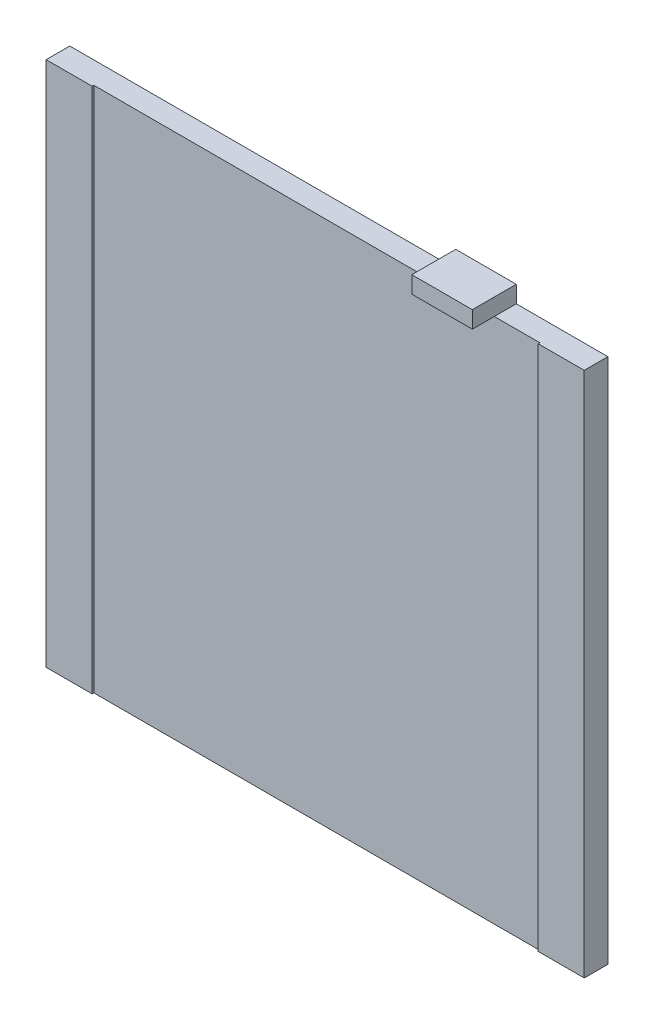
ISO-10303-21;
HEADER;
FILE_DESCRIPTION(('STEP AP214'),'2;1');
FILE_NAME('part.step','',(''),(''),'','','');
FILE_SCHEMA(('AUTOMOTIVE_DESIGN { 1 0 10303 214 1 1 1 1 }'));
ENDSEC;
DATA;
#1=APPLICATION_CONTEXT('core data for automotive mechanical design processes');
#2=APPLICATION_PROTOCOL_DEFINITION('international standard','automotive_design',2000,#1);
#3=PRODUCT_CONTEXT('',#1,'mechanical');
#4=PRODUCT('Part','Part','',(#3));
#5=PRODUCT_RELATED_PRODUCT_CATEGORY('part','',(#4));
#6=PRODUCT_DEFINITION_FORMATION('','',#4);
#7=PRODUCT_DEFINITION_CONTEXT('part definition',#1,'design');
#8=PRODUCT_DEFINITION('design','',#6,#7);
#9=PRODUCT_DEFINITION_SHAPE('','',#8);
#10=(LENGTH_UNIT() NAMED_UNIT(*) SI_UNIT(.MILLI.,.METRE.));
#11=(NAMED_UNIT(*) PLANE_ANGLE_UNIT() SI_UNIT($,.RADIAN.));
#12=(NAMED_UNIT(*) SI_UNIT($,.STERADIAN.) SOLID_ANGLE_UNIT());
#13=UNCERTAINTY_MEASURE_WITH_UNIT(LENGTH_MEASURE(1.E-05),#10,'distance_accuracy_value','');
#14=(GEOMETRIC_REPRESENTATION_CONTEXT(3) GLOBAL_UNCERTAINTY_ASSIGNED_CONTEXT((#13)) GLOBAL_UNIT_ASSIGNED_CONTEXT((#10,
#11,#12)) REPRESENTATION_CONTEXT('',''));
#15=CARTESIAN_POINT('',(0.,0.,0.));
#16=DIRECTION('',(0.,0.,1.));
#17=DIRECTION('',(1.,0.,0.));
#18=AXIS2_PLACEMENT_3D('',#15,#16,#17);
#19=CARTESIAN_POINT('',(0.,155.74,6.5));
#20=DIRECTION('',(0.,-1.,0.));
#21=DIRECTION('',(0.,0.,-1.));
#22=AXIS2_PLACEMENT_3D('',#19,#20,#21);
#23=PLANE('',#22);
#24=DIRECTION('',(0.,0.,-1.));
#25=VECTOR('',#24,1.);
#26=CARTESIAN_POINT('',(132.14,155.74,0.));
#27=LINE('',#26,#25);
#28=CARTESIAN_POINT('',(132.14,155.74,6.5));
#29=VERTEX_POINT('',#28);
#30=CARTESIAN_POINT('',(132.14,155.74,0.));
#31=VERTEX_POINT('',#30);
#32=EDGE_CURVE('E11',#29,#31,#27,.T.);
#33=ORIENTED_EDGE('',*,*,#32,.F.);
#34=DIRECTION('',(-1.,0.,0.));
#35=VECTOR('',#34,1.);
#36=CARTESIAN_POINT('',(0.,155.74,6.5));
#37=LINE('',#36,#35);
#38=CARTESIAN_POINT('',(145.64,155.74,6.5));
#39=VERTEX_POINT('',#38);
#40=EDGE_CURVE('E203',#39,#29,#37,.T.);
#41=ORIENTED_EDGE('',*,*,#40,.F.);
#42=DIRECTION('',(0.,0.,-1.));
#43=VECTOR('',#42,1.);
#44=CARTESIAN_POINT('',(145.64,155.74,7.));
#45=LINE('',#44,#43);
#46=CARTESIAN_POINT('',(145.64,155.74,7.));
#47=VERTEX_POINT('',#46);
#48=EDGE_CURVE('E195',#47,#39,#45,.T.);
#49=ORIENTED_EDGE('',*,*,#48,.F.);
#50=DIRECTION('',(-1.,0.,0.));
#51=VECTOR('',#50,1.);
#52=CARTESIAN_POINT('',(159.25,155.74,7.));
#53=LINE('',#52,#51);
#54=CARTESIAN_POINT('',(159.25,155.74,7.));
#55=VERTEX_POINT('',#54);
#56=EDGE_CURVE('E179',#55,#47,#53,.T.);
#57=ORIENTED_EDGE('',*,*,#56,.F.);
#58=DIRECTION('',(0.,0.,-1.));
#59=VECTOR('',#58,1.);
#60=CARTESIAN_POINT('',(159.25,155.74,6.5));
#61=LINE('',#60,#59);
#62=CARTESIAN_POINT('',(159.25,155.74,0.));
#63=VERTEX_POINT('',#62);
#64=EDGE_CURVE('E217',#55,#63,#61,.T.);
#65=ORIENTED_EDGE('',*,*,#64,.T.);
#66=DIRECTION('',(-1.,0.,0.));
#67=VECTOR('',#66,1.);
#68=CARTESIAN_POINT('',(0.,155.74,0.));
#69=LINE('',#68,#67);
#70=EDGE_CURVE('E202',#63,#31,#69,.T.);
#71=ORIENTED_EDGE('',*,*,#70,.T.);
#72=EDGE_LOOP('',(#33,#41,#49,#57,#65,#71));
#73=FACE_BOUND('',#72,.T.);
#74=ADVANCED_FACE('F32',(#73),#23,.F.);
#75=DIRECTION('',(0.,0.,1.));
#76=VECTOR('',#75,1.);
#77=CARTESIAN_POINT('',(114.22,155.74,0.));
#78=LINE('',#77,#76);
#79=CARTESIAN_POINT('',(114.22,155.74,0.));
#80=VERTEX_POINT('',#79);
#81=CARTESIAN_POINT('',(114.22,155.74,6.5));
#82=VERTEX_POINT('',#81);
#83=EDGE_CURVE('E55',#80,#82,#78,.T.);
#84=ORIENTED_EDGE('',*,*,#83,.F.);
#85=CARTESIAN_POINT('',(0.,155.74,0.));
#86=VERTEX_POINT('',#85);
#87=EDGE_CURVE('E213',#80,#86,#69,.T.);
#88=ORIENTED_EDGE('',*,*,#87,.T.);
#89=DIRECTION('',(0.,0.,-1.));
#90=VECTOR('',#89,1.);
#91=CARTESIAN_POINT('',(0.,155.74,6.5));
#92=LINE('',#91,#90);
#93=CARTESIAN_POINT('',(0.,155.74,7.));
#94=VERTEX_POINT('',#93);
#95=EDGE_CURVE('E205',#94,#86,#92,.T.);
#96=ORIENTED_EDGE('',*,*,#95,.F.);
#97=DIRECTION('',(1.,0.,0.));
#98=VECTOR('',#97,1.);
#99=CARTESIAN_POINT('',(0.,155.74,7.));
#100=LINE('',#99,#98);
#101=CARTESIAN_POINT('',(13.61,155.74,7.));
#102=VERTEX_POINT('',#101);
#103=EDGE_CURVE('E169',#94,#102,#100,.T.);
#104=ORIENTED_EDGE('',*,*,#103,.T.);
#105=DIRECTION('',(0.,0.,-1.));
#106=VECTOR('',#105,1.);
#107=CARTESIAN_POINT('',(13.61,155.74,7.));
#108=LINE('',#107,#106);
#109=CARTESIAN_POINT('',(13.61,155.74,6.5));
#110=VERTEX_POINT('',#109);
#111=EDGE_CURVE('E157',#102,#110,#108,.T.);
#112=ORIENTED_EDGE('',*,*,#111,.T.);
#113=EDGE_CURVE('E201',#82,#110,#37,.T.);
#114=ORIENTED_EDGE('',*,*,#113,.F.);
#115=EDGE_LOOP('',(#84,#88,#96,#104,#112,#114));
#116=FACE_BOUND('',#115,.T.);
#117=ADVANCED_FACE('F251',(#116),#23,.F.);
#118=CARTESIAN_POINT('',(0.,0.,6.5));
#119=DIRECTION('',(0.,0.,-1.));
#120=DIRECTION('',(-1.,0.,0.));
#121=AXIS2_PLACEMENT_3D('',#118,#119,#120);
#122=PLANE('',#121);
#123=ORIENTED_EDGE('',*,*,#40,.T.);
#124=EDGE_CURVE('E206',#29,#82,#37,.T.);
#125=ORIENTED_EDGE('',*,*,#124,.T.);
#126=ORIENTED_EDGE('',*,*,#113,.T.);
#127=DIRECTION('',(0.,-1.,0.));
#128=VECTOR('',#127,1.);
#129=CARTESIAN_POINT('',(13.61,155.74,6.5));
#130=LINE('',#129,#128);
#131=CARTESIAN_POINT('',(13.61,0.,6.5));
#132=VERTEX_POINT('',#131);
#133=EDGE_CURVE('E166',#110,#132,#130,.T.);
#134=ORIENTED_EDGE('',*,*,#133,.T.);
#135=DIRECTION('',(1.,0.,0.));
#136=VECTOR('',#135,1.);
#137=CARTESIAN_POINT('',(0.,0.,6.5));
#138=LINE('',#137,#136);
#139=CARTESIAN_POINT('',(145.64,0.,6.5));
#140=VERTEX_POINT('',#139);
#141=EDGE_CURVE('E199',#132,#140,#138,.T.);
#142=ORIENTED_EDGE('',*,*,#141,.T.);
#143=DIRECTION('',(0.,-1.,0.));
#144=VECTOR('',#143,1.);
#145=CARTESIAN_POINT('',(145.64,155.74,6.5));
#146=LINE('',#145,#144);
#147=EDGE_CURVE('E168',#39,#140,#146,.T.);
#148=ORIENTED_EDGE('',*,*,#147,.F.);
#149=EDGE_LOOP('',(#123,#125,#126,#134,#142,#148));
#150=FACE_BOUND('',#149,.T.);
#151=ADVANCED_FACE('F242',(#150),#122,.F.);
#152=CARTESIAN_POINT('',(0.,0.,6.5));
#153=DIRECTION('',(1.,0.,0.));
#154=DIRECTION('',(0.,0.,-1.));
#155=AXIS2_PLACEMENT_3D('',#152,#153,#154);
#156=PLANE('',#155);
#157=DIRECTION('',(0.,-1.,0.));
#158=VECTOR('',#157,1.);
#159=CARTESIAN_POINT('',(0.,0.,0.));
#160=LINE('',#159,#158);
#161=CARTESIAN_POINT('',(0.,0.,0.));
#162=VERTEX_POINT('',#161);
#163=EDGE_CURVE('E198',#86,#162,#160,.T.);
#164=ORIENTED_EDGE('',*,*,#163,.T.);
#165=DIRECTION('',(0.,0.,-1.));
#166=VECTOR('',#165,1.);
#167=CARTESIAN_POINT('',(0.,0.,6.5));
#168=LINE('',#167,#166);
#169=CARTESIAN_POINT('',(0.,0.,7.));
#170=VERTEX_POINT('',#169);
#171=EDGE_CURVE('E36',#170,#162,#168,.T.);
#172=ORIENTED_EDGE('',*,*,#171,.F.);
#173=DIRECTION('',(0.,-1.,0.));
#174=VECTOR('',#173,1.);
#175=CARTESIAN_POINT('',(0.,155.74,7.));
#176=LINE('',#175,#174);
#177=EDGE_CURVE('E164',#94,#170,#176,.T.);
#178=ORIENTED_EDGE('',*,*,#177,.F.);
#179=ORIENTED_EDGE('',*,*,#95,.T.);
#180=EDGE_LOOP('',(#164,#172,#178,#179));
#181=FACE_BOUND('',#180,.T.);
#182=ADVANCED_FACE('F34',(#181),#156,.F.);
#183=CARTESIAN_POINT('',(0.,0.,6.5));
#184=DIRECTION('',(0.,1.,0.));
#185=DIRECTION('',(0.,0.,1.));
#186=AXIS2_PLACEMENT_3D('',#183,#184,#185);
#187=PLANE('',#186);
#188=DIRECTION('',(1.,0.,0.));
#189=VECTOR('',#188,1.);
#190=CARTESIAN_POINT('',(0.,0.,0.));
#191=LINE('',#190,#189);
#192=CARTESIAN_POINT('',(159.25,0.,0.));
#193=VERTEX_POINT('',#192);
#194=EDGE_CURVE('E209',#162,#193,#191,.T.);
#195=ORIENTED_EDGE('',*,*,#194,.T.);
#196=DIRECTION('',(0.,0.,-1.));
#197=VECTOR('',#196,1.);
#198=CARTESIAN_POINT('',(159.25,0.,6.5));
#199=LINE('',#198,#197);
#200=CARTESIAN_POINT('',(159.25,0.,7.));
#201=VERTEX_POINT('',#200);
#202=EDGE_CURVE('E219',#201,#193,#199,.T.);
#203=ORIENTED_EDGE('',*,*,#202,.F.);
#204=DIRECTION('',(-1.,0.,0.));
#205=VECTOR('',#204,1.);
#206=CARTESIAN_POINT('',(159.25,0.,7.));
#207=LINE('',#206,#205);
#208=CARTESIAN_POINT('',(145.64,0.,7.));
#209=VERTEX_POINT('',#208);
#210=EDGE_CURVE('E184',#201,#209,#207,.T.);
#211=ORIENTED_EDGE('',*,*,#210,.T.);
#212=DIRECTION('',(0.,0.,-1.));
#213=VECTOR('',#212,1.);
#214=CARTESIAN_POINT('',(145.64,0.,7.));
#215=LINE('',#214,#213);
#216=EDGE_CURVE('E190',#209,#140,#215,.T.);
#217=ORIENTED_EDGE('',*,*,#216,.T.);
#218=ORIENTED_EDGE('',*,*,#141,.F.);
#219=DIRECTION('',(0.,0.,-1.));
#220=VECTOR('',#219,1.);
#221=CARTESIAN_POINT('',(13.61,0.,7.));
#222=LINE('',#221,#220);
#223=CARTESIAN_POINT('',(13.61,0.,7.));
#224=VERTEX_POINT('',#223);
#225=EDGE_CURVE('E154',#224,#132,#222,.T.);
#226=ORIENTED_EDGE('',*,*,#225,.F.);
#227=DIRECTION('',(1.,0.,0.));
#228=VECTOR('',#227,1.);
#229=CARTESIAN_POINT('',(0.,0.,7.));
#230=LINE('',#229,#228);
#231=EDGE_CURVE('E172',#170,#224,#230,.T.);
#232=ORIENTED_EDGE('',*,*,#231,.F.);
#233=ORIENTED_EDGE('',*,*,#171,.T.);
#234=EDGE_LOOP('',(#195,#203,#211,#217,#218,#226,#232,#233));
#235=FACE_BOUND('',#234,.T.);
#236=ADVANCED_FACE('F226',(#235),#187,.F.);
#237=CARTESIAN_POINT('',(159.25,0.,6.5));
#238=DIRECTION('',(-1.,0.,0.));
#239=DIRECTION('',(0.,0.,1.));
#240=AXIS2_PLACEMENT_3D('',#237,#238,#239);
#241=PLANE('',#240);
#242=DIRECTION('',(0.,1.,0.));
#243=VECTOR('',#242,1.);
#244=CARTESIAN_POINT('',(159.25,0.,0.));
#245=LINE('',#244,#243);
#246=EDGE_CURVE('E211',#193,#63,#245,.T.);
#247=ORIENTED_EDGE('',*,*,#246,.T.);
#248=ORIENTED_EDGE('',*,*,#64,.F.);
#249=DIRECTION('',(0.,-1.,0.));
#250=VECTOR('',#249,1.);
#251=CARTESIAN_POINT('',(159.25,155.74,7.));
#252=LINE('',#251,#250);
#253=EDGE_CURVE('E187',#55,#201,#252,.T.);
#254=ORIENTED_EDGE('',*,*,#253,.T.);
#255=ORIENTED_EDGE('',*,*,#202,.T.);
#256=EDGE_LOOP('',(#247,#248,#254,#255));
#257=FACE_BOUND('',#256,.T.);
#258=ADVANCED_FACE('F230',(#257),#241,.F.);
#259=CARTESIAN_POINT('',(0.,0.,0.));
#260=DIRECTION('',(0.,0.,-1.));
#261=DIRECTION('',(-1.,0.,0.));
#262=AXIS2_PLACEMENT_3D('',#259,#260,#261);
#263=PLANE('',#262);
#264=ORIENTED_EDGE('',*,*,#163,.F.);
#265=ORIENTED_EDGE('',*,*,#87,.F.);
#266=DIRECTION('',(0.,-1.,0.));
#267=VECTOR('',#266,1.);
#268=CARTESIAN_POINT('',(114.22,160.74,0.));
#269=LINE('',#268,#267);
#270=CARTESIAN_POINT('',(114.22,160.74,0.));
#271=VERTEX_POINT('',#270);
#272=EDGE_CURVE('E137',#271,#80,#269,.T.);
#273=ORIENTED_EDGE('',*,*,#272,.F.);
#274=DIRECTION('',(-1.,0.,0.));
#275=VECTOR('',#274,1.);
#276=CARTESIAN_POINT('',(132.14,160.74,0.));
#277=LINE('',#276,#275);
#278=CARTESIAN_POINT('',(132.14,160.74,0.));
#279=VERTEX_POINT('',#278);
#280=EDGE_CURVE('E129',#279,#271,#277,.T.);
#281=ORIENTED_EDGE('',*,*,#280,.F.);
#282=DIRECTION('',(0.,-1.,0.));
#283=VECTOR('',#282,1.);
#284=CARTESIAN_POINT('',(132.14,160.74,0.));
#285=LINE('',#284,#283);
#286=EDGE_CURVE('E135',#279,#31,#285,.T.);
#287=ORIENTED_EDGE('',*,*,#286,.T.);
#288=ORIENTED_EDGE('',*,*,#70,.F.);
#289=ORIENTED_EDGE('',*,*,#246,.F.);
#290=ORIENTED_EDGE('',*,*,#194,.F.);
#291=EDGE_LOOP('',(#264,#265,#273,#281,#287,#288,#289,#290));
#292=FACE_BOUND('',#291,.T.);
#293=ADVANCED_FACE('F132',(#292),#263,.T.);
#294=CARTESIAN_POINT('',(145.64,155.74,7.));
#295=DIRECTION('',(1.,0.,0.));
#296=DIRECTION('',(0.,1.,0.));
#297=AXIS2_PLACEMENT_3D('',#294,#295,#296);
#298=PLANE('',#297);
#299=ORIENTED_EDGE('',*,*,#147,.T.);
#300=ORIENTED_EDGE('',*,*,#216,.F.);
#301=DIRECTION('',(0.,-1.,0.));
#302=VECTOR('',#301,1.);
#303=CARTESIAN_POINT('',(145.64,155.74,7.));
#304=LINE('',#303,#302);
#305=EDGE_CURVE('E182',#47,#209,#304,.T.);
#306=ORIENTED_EDGE('',*,*,#305,.F.);
#307=ORIENTED_EDGE('',*,*,#48,.T.);
#308=EDGE_LOOP('',(#299,#300,#306,#307));
#309=FACE_BOUND('',#308,.T.);
#310=ADVANCED_FACE('F240',(#309),#298,.F.);
#311=CARTESIAN_POINT('',(0.,0.,7.));
#312=DIRECTION('',(0.,0.,1.));
#313=DIRECTION('',(1.,0.,0.));
#314=AXIS2_PLACEMENT_3D('',#311,#312,#313);
#315=PLANE('',#314);
#316=ORIENTED_EDGE('',*,*,#56,.T.);
#317=ORIENTED_EDGE('',*,*,#305,.T.);
#318=ORIENTED_EDGE('',*,*,#210,.F.);
#319=ORIENTED_EDGE('',*,*,#253,.F.);
#320=EDGE_LOOP('',(#316,#317,#318,#319));
#321=FACE_BOUND('',#320,.T.);
#322=ADVANCED_FACE('F236',(#321),#315,.T.);
#323=CARTESIAN_POINT('',(13.61,155.74,7.));
#324=DIRECTION('',(1.,0.,0.));
#325=DIRECTION('',(0.,1.,0.));
#326=AXIS2_PLACEMENT_3D('',#323,#324,#325);
#327=PLANE('',#326);
#328=ORIENTED_EDGE('',*,*,#133,.F.);
#329=ORIENTED_EDGE('',*,*,#111,.F.);
#330=DIRECTION('',(0.,-1.,0.));
#331=VECTOR('',#330,1.);
#332=CARTESIAN_POINT('',(13.61,155.74,7.));
#333=LINE('',#332,#331);
#334=EDGE_CURVE('E174',#102,#224,#333,.T.);
#335=ORIENTED_EDGE('',*,*,#334,.T.);
#336=ORIENTED_EDGE('',*,*,#225,.T.);
#337=EDGE_LOOP('',(#328,#329,#335,#336));
#338=FACE_BOUND('',#337,.T.);
#339=ADVANCED_FACE('F246',(#338),#327,.T.);
#340=CARTESIAN_POINT('',(0.,0.,7.));
#341=DIRECTION('',(0.,0.,-1.));
#342=DIRECTION('',(-1.,0.,0.));
#343=AXIS2_PLACEMENT_3D('',#340,#341,#342);
#344=PLANE('',#343);
#345=ORIENTED_EDGE('',*,*,#103,.F.);
#346=ORIENTED_EDGE('',*,*,#177,.T.);
#347=ORIENTED_EDGE('',*,*,#231,.T.);
#348=ORIENTED_EDGE('',*,*,#334,.F.);
#349=EDGE_LOOP('',(#345,#346,#347,#348));
#350=FACE_BOUND('',#349,.T.);
#351=ADVANCED_FACE('F250',(#350),#344,.F.);
#352=CARTESIAN_POINT('',(0.,155.74,0.));
#353=DIRECTION('',(0.,-1.,0.));
#354=DIRECTION('',(0.,0.,-1.));
#355=AXIS2_PLACEMENT_3D('',#352,#353,#354);
#356=PLANE('',#355);
#357=ORIENTED_EDGE('',*,*,#124,.F.);
#358=CARTESIAN_POINT('',(132.14,155.74,13.));
#359=VERTEX_POINT('',#358);
#360=EDGE_CURVE('E42',#359,#29,#27,.T.);
#361=ORIENTED_EDGE('',*,*,#360,.F.);
#362=DIRECTION('',(1.,0.,0.));
#363=VECTOR('',#362,1.);
#364=CARTESIAN_POINT('',(132.14,155.74,13.));
#365=LINE('',#364,#363);
#366=CARTESIAN_POINT('',(114.22,155.74,13.));
#367=VERTEX_POINT('',#366);
#368=EDGE_CURVE('E150',#367,#359,#365,.T.);
#369=ORIENTED_EDGE('',*,*,#368,.F.);
#370=EDGE_CURVE('E255',#82,#367,#78,.T.);
#371=ORIENTED_EDGE('',*,*,#370,.F.);
#372=EDGE_LOOP('',(#357,#361,#369,#371));
#373=FACE_BOUND('',#372,.T.);
#374=ADVANCED_FACE('F256',(#373),#356,.T.);
#375=CARTESIAN_POINT('',(132.14,160.74,0.));
#376=DIRECTION('',(-1.,0.,0.));
#377=DIRECTION('',(0.,0.,1.));
#378=AXIS2_PLACEMENT_3D('',#375,#376,#377);
#379=PLANE('',#378);
#380=ORIENTED_EDGE('',*,*,#360,.T.);
#381=ORIENTED_EDGE('',*,*,#32,.T.);
#382=ORIENTED_EDGE('',*,*,#286,.F.);
#383=DIRECTION('',(0.,0.,-1.));
#384=VECTOR('',#383,1.);
#385=CARTESIAN_POINT('',(132.14,160.74,0.));
#386=LINE('',#385,#384);
#387=CARTESIAN_POINT('',(132.14,160.74,13.));
#388=VERTEX_POINT('',#387);
#389=EDGE_CURVE('E141',#388,#279,#386,.T.);
#390=ORIENTED_EDGE('',*,*,#389,.F.);
#391=DIRECTION('',(0.,-1.,0.));
#392=VECTOR('',#391,1.);
#393=CARTESIAN_POINT('',(132.14,160.74,13.));
#394=LINE('',#393,#392);
#395=EDGE_CURVE('E266',#388,#359,#394,.T.);
#396=ORIENTED_EDGE('',*,*,#395,.T.);
#397=EDGE_LOOP('',(#380,#381,#382,#390,#396));
#398=FACE_BOUND('',#397,.T.);
#399=ADVANCED_FACE('F153',(#398),#379,.F.);
#400=CARTESIAN_POINT('',(114.22,160.74,0.));
#401=DIRECTION('',(1.,0.,0.));
#402=DIRECTION('',(0.,0.,-1.));
#403=AXIS2_PLACEMENT_3D('',#400,#401,#402);
#404=PLANE('',#403);
#405=ORIENTED_EDGE('',*,*,#83,.T.);
#406=ORIENTED_EDGE('',*,*,#370,.T.);
#407=DIRECTION('',(0.,-1.,0.));
#408=VECTOR('',#407,1.);
#409=CARTESIAN_POINT('',(114.22,160.74,13.));
#410=LINE('',#409,#408);
#411=CARTESIAN_POINT('',(114.22,160.74,13.));
#412=VERTEX_POINT('',#411);
#413=EDGE_CURVE('E159',#412,#367,#410,.T.);
#414=ORIENTED_EDGE('',*,*,#413,.F.);
#415=DIRECTION('',(0.,0.,1.));
#416=VECTOR('',#415,1.);
#417=CARTESIAN_POINT('',(114.22,160.74,0.));
#418=LINE('',#417,#416);
#419=EDGE_CURVE('E140',#271,#412,#418,.T.);
#420=ORIENTED_EDGE('',*,*,#419,.F.);
#421=ORIENTED_EDGE('',*,*,#272,.T.);
#422=EDGE_LOOP('',(#405,#406,#414,#420,#421));
#423=FACE_BOUND('',#422,.T.);
#424=ADVANCED_FACE('F262',(#423),#404,.F.);
#425=CARTESIAN_POINT('',(132.14,160.74,13.));
#426=DIRECTION('',(0.,0.,-1.));
#427=DIRECTION('',(-1.,0.,0.));
#428=AXIS2_PLACEMENT_3D('',#425,#426,#427);
#429=PLANE('',#428);
#430=ORIENTED_EDGE('',*,*,#368,.T.);
#431=ORIENTED_EDGE('',*,*,#395,.F.);
#432=DIRECTION('',(1.,0.,0.));
#433=VECTOR('',#432,1.);
#434=CARTESIAN_POINT('',(132.14,160.74,13.));
#435=LINE('',#434,#433);
#436=EDGE_CURVE('E146',#412,#388,#435,.T.);
#437=ORIENTED_EDGE('',*,*,#436,.F.);
#438=ORIENTED_EDGE('',*,*,#413,.T.);
#439=EDGE_LOOP('',(#430,#431,#437,#438));
#440=FACE_BOUND('',#439,.T.);
#441=ADVANCED_FACE('F268',(#440),#429,.F.);
#442=CARTESIAN_POINT('',(0.,160.74,0.));
#443=DIRECTION('',(0.,-1.,0.));
#444=DIRECTION('',(0.,0.,-1.));
#445=AXIS2_PLACEMENT_3D('',#442,#443,#444);
#446=PLANE('',#445);
#447=ORIENTED_EDGE('',*,*,#389,.T.);
#448=ORIENTED_EDGE('',*,*,#280,.T.);
#449=ORIENTED_EDGE('',*,*,#419,.T.);
#450=ORIENTED_EDGE('',*,*,#436,.T.);
#451=EDGE_LOOP('',(#447,#448,#449,#450));
#452=FACE_BOUND('',#451,.T.);
#453=ADVANCED_FACE('F144',(#452),#446,.F.);
#454=CLOSED_SHELL('',(#74,#117,#151,#182,#236,#258,#293,#310,#322,#339,#351,#374,#399,#424,#441,#453));
#455=MANIFOLD_SOLID_BREP('B2',#454);
#456=ADVANCED_BREP_SHAPE_REPRESENTATION('',(#18,#455),#14);
#457=SHAPE_DEFINITION_REPRESENTATION(#9,#456);
ENDSEC;
END-ISO-10303-21;
